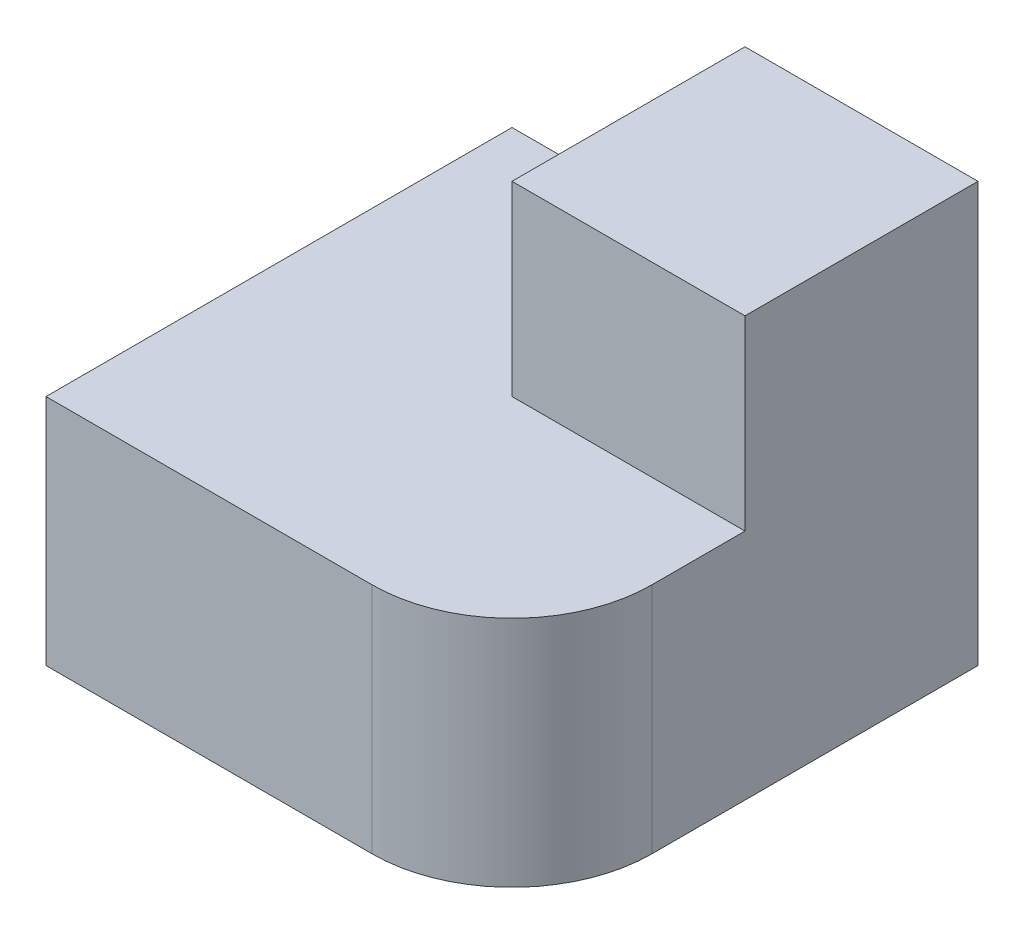
ISO-10303-21;
HEADER;
FILE_DESCRIPTION(('STEP AP214'),'2;1');
FILE_NAME('part.step','',(''),(''),'','','');
FILE_SCHEMA(('AUTOMOTIVE_DESIGN { 1 0 10303 214 1 1 1 1 }'));
ENDSEC;
DATA;
#1=APPLICATION_CONTEXT('core data for automotive mechanical design processes');
#2=APPLICATION_PROTOCOL_DEFINITION('international standard','automotive_design',2000,#1);
#3=PRODUCT_CONTEXT('',#1,'mechanical');
#4=PRODUCT('Part','Part','',(#3));
#5=PRODUCT_RELATED_PRODUCT_CATEGORY('part','',(#4));
#6=PRODUCT_DEFINITION_FORMATION('','',#4);
#7=PRODUCT_DEFINITION_CONTEXT('part definition',#1,'design');
#8=PRODUCT_DEFINITION('design','',#6,#7);
#9=PRODUCT_DEFINITION_SHAPE('','',#8);
#10=(LENGTH_UNIT() NAMED_UNIT(*) SI_UNIT(.MILLI.,.METRE.));
#11=(NAMED_UNIT(*) PLANE_ANGLE_UNIT() SI_UNIT($,.RADIAN.));
#12=(NAMED_UNIT(*) SI_UNIT($,.STERADIAN.) SOLID_ANGLE_UNIT());
#13=UNCERTAINTY_MEASURE_WITH_UNIT(LENGTH_MEASURE(1.E-05),#10,'distance_accuracy_value','');
#14=(GEOMETRIC_REPRESENTATION_CONTEXT(3) GLOBAL_UNCERTAINTY_ASSIGNED_CONTEXT((#13)) GLOBAL_UNIT_ASSIGNED_CONTEXT((#10,
#11,#12)) REPRESENTATION_CONTEXT('',''));
#15=CARTESIAN_POINT('',(0.,0.,0.));
#16=DIRECTION('',(0.,0.,1.));
#17=DIRECTION('',(1.,0.,0.));
#18=AXIS2_PLACEMENT_3D('',#15,#16,#17);
#19=CARTESIAN_POINT('',(-5.,5.,5.));
#20=DIRECTION('',(1.,0.,0.));
#21=DIRECTION('',(0.,0.,-1.));
#22=AXIS2_PLACEMENT_3D('',#19,#20,#21);
#23=PLANE('',#22);
#24=DIRECTION('',(0.,0.,1.));
#25=VECTOR('',#24,1.);
#26=CARTESIAN_POINT('',(-5.,0.,5.));
#27=LINE('',#26,#25);
#28=CARTESIAN_POINT('',(-5.,0.,-5.));
#29=VERTEX_POINT('',#28);
#30=CARTESIAN_POINT('',(-5.,0.,5.));
#31=VERTEX_POINT('',#30);
#32=EDGE_CURVE('E140',#29,#31,#27,.T.);
#33=ORIENTED_EDGE('',*,*,#32,.T.);
#34=DIRECTION('',(0.,-1.,0.));
#35=VECTOR('',#34,1.);
#36=CARTESIAN_POINT('',(-5.,5.,5.));
#37=LINE('',#36,#35);
#38=CARTESIAN_POINT('',(-5.,5.,5.));
#39=VERTEX_POINT('',#38);
#40=EDGE_CURVE('E107',#39,#31,#37,.T.);
#41=ORIENTED_EDGE('',*,*,#40,.F.);
#42=DIRECTION('',(0.,0.,1.));
#43=VECTOR('',#42,1.);
#44=CARTESIAN_POINT('',(-5.,5.,5.));
#45=LINE('',#44,#43);
#46=CARTESIAN_POINT('',(-5.,5.,-5.));
#47=VERTEX_POINT('',#46);
#48=EDGE_CURVE('E141',#47,#39,#45,.T.);
#49=ORIENTED_EDGE('',*,*,#48,.F.);
#50=DIRECTION('',(0.,-1.,0.));
#51=VECTOR('',#50,1.);
#52=CARTESIAN_POINT('',(-5.,5.,-5.));
#53=LINE('',#52,#51);
#54=EDGE_CURVE('E108',#47,#29,#53,.T.);
#55=ORIENTED_EDGE('',*,*,#54,.T.);
#56=EDGE_LOOP('',(#33,#41,#49,#55));
#57=FACE_BOUND('',#56,.T.);
#58=ADVANCED_FACE('F33',(#57),#23,.F.);
#59=CARTESIAN_POINT('',(5.,5.,5.));
#60=DIRECTION('',(0.,0.,-1.));
#61=DIRECTION('',(-1.,0.,0.));
#62=AXIS2_PLACEMENT_3D('',#59,#60,#61);
#63=PLANE('',#62);
#64=DIRECTION('',(1.,0.,0.));
#65=VECTOR('',#64,1.);
#66=CARTESIAN_POINT('',(5.,0.,5.));
#67=LINE('',#66,#65);
#68=CARTESIAN_POINT('',(2.,0.,5.));
#69=VERTEX_POINT('',#68);
#70=EDGE_CURVE('E153',#31,#69,#67,.T.);
#71=ORIENTED_EDGE('',*,*,#70,.T.);
#72=DIRECTION('',(0.,-1.,0.));
#73=VECTOR('',#72,1.);
#74=CARTESIAN_POINT('',(2.,5.,5.));
#75=LINE('',#74,#73);
#76=CARTESIAN_POINT('',(2.,5.,5.));
#77=VERTEX_POINT('',#76);
#78=EDGE_CURVE('E41',#69,#77,#75,.F.);
#79=ORIENTED_EDGE('',*,*,#78,.T.);
#80=DIRECTION('',(1.,0.,0.));
#81=VECTOR('',#80,1.);
#82=CARTESIAN_POINT('',(5.,5.,5.));
#83=LINE('',#82,#81);
#84=EDGE_CURVE('E144',#39,#77,#83,.T.);
#85=ORIENTED_EDGE('',*,*,#84,.F.);
#86=ORIENTED_EDGE('',*,*,#40,.T.);
#87=EDGE_LOOP('',(#71,#79,#85,#86));
#88=FACE_BOUND('',#87,.T.);
#89=ADVANCED_FACE('F185',(#88),#63,.F.);
#90=CARTESIAN_POINT('',(5.,5.,5.));
#91=DIRECTION('',(-1.,0.,0.));
#92=DIRECTION('',(0.,0.,1.));
#93=AXIS2_PLACEMENT_3D('',#90,#91,#92);
#94=PLANE('',#93);
#95=DIRECTION('',(0.,0.,-1.));
#96=VECTOR('',#95,1.);
#97=CARTESIAN_POINT('',(5.,5.,5.));
#98=LINE('',#97,#96);
#99=CARTESIAN_POINT('',(5.,5.,2.));
#100=VERTEX_POINT('',#99);
#101=CARTESIAN_POINT('',(5.,5.,0.));
#102=VERTEX_POINT('',#101);
#103=EDGE_CURVE('E147',#100,#102,#98,.T.);
#104=ORIENTED_EDGE('',*,*,#103,.F.);
#105=DIRECTION('',(0.,-1.,0.));
#106=VECTOR('',#105,1.);
#107=CARTESIAN_POINT('',(5.,5.,2.));
#108=LINE('',#107,#106);
#109=CARTESIAN_POINT('',(5.,0.,2.));
#110=VERTEX_POINT('',#109);
#111=EDGE_CURVE('E161',#100,#110,#108,.T.);
#112=ORIENTED_EDGE('',*,*,#111,.T.);
#113=DIRECTION('',(0.,0.,-1.));
#114=VECTOR('',#113,1.);
#115=CARTESIAN_POINT('',(5.,0.,5.));
#116=LINE('',#115,#114);
#117=CARTESIAN_POINT('',(5.,0.,-5.));
#118=VERTEX_POINT('',#117);
#119=EDGE_CURVE('E104',#110,#118,#116,.T.);
#120=ORIENTED_EDGE('',*,*,#119,.T.);
#121=DIRECTION('',(0.,-1.,0.));
#122=VECTOR('',#121,1.);
#123=CARTESIAN_POINT('',(5.,5.,-5.));
#124=LINE('',#123,#122);
#125=CARTESIAN_POINT('',(5.,9.,-5.));
#126=VERTEX_POINT('',#125);
#127=EDGE_CURVE('E96',#126,#118,#124,.T.);
#128=ORIENTED_EDGE('',*,*,#127,.F.);
#129=DIRECTION('',(0.,0.,-1.));
#130=VECTOR('',#129,1.);
#131=CARTESIAN_POINT('',(5.,9.,-5.));
#132=LINE('',#131,#130);
#133=CARTESIAN_POINT('',(5.,9.,0.));
#134=VERTEX_POINT('',#133);
#135=EDGE_CURVE('E102',#134,#126,#132,.T.);
#136=ORIENTED_EDGE('',*,*,#135,.F.);
#137=DIRECTION('',(0.,-1.,0.));
#138=VECTOR('',#137,1.);
#139=CARTESIAN_POINT('',(5.,9.,0.));
#140=LINE('',#139,#138);
#141=EDGE_CURVE('E132',#134,#102,#140,.T.);
#142=ORIENTED_EDGE('',*,*,#141,.T.);
#143=EDGE_LOOP('',(#104,#112,#120,#128,#136,#142));
#144=FACE_BOUND('',#143,.T.);
#145=ADVANCED_FACE('F99',(#144),#94,.F.);
#146=CARTESIAN_POINT('',(5.,5.,-5.));
#147=DIRECTION('',(0.,0.,1.));
#148=DIRECTION('',(1.,0.,0.));
#149=AXIS2_PLACEMENT_3D('',#146,#147,#148);
#150=PLANE('',#149);
#151=DIRECTION('',(-1.,0.,0.));
#152=VECTOR('',#151,1.);
#153=CARTESIAN_POINT('',(5.,0.,-5.));
#154=LINE('',#153,#152);
#155=EDGE_CURVE('E145',#118,#29,#154,.T.);
#156=ORIENTED_EDGE('',*,*,#155,.T.);
#157=ORIENTED_EDGE('',*,*,#54,.F.);
#158=DIRECTION('',(-1.,0.,0.));
#159=VECTOR('',#158,1.);
#160=CARTESIAN_POINT('',(5.,5.,-5.));
#161=LINE('',#160,#159);
#162=CARTESIAN_POINT('',(0.,5.,-5.));
#163=VERTEX_POINT('',#162);
#164=EDGE_CURVE('E149',#163,#47,#161,.T.);
#165=ORIENTED_EDGE('',*,*,#164,.F.);
#166=DIRECTION('',(0.,-1.,0.));
#167=VECTOR('',#166,1.);
#168=CARTESIAN_POINT('',(0.,9.,-5.));
#169=LINE('',#168,#167);
#170=CARTESIAN_POINT('',(0.,9.,-5.));
#171=VERTEX_POINT('',#170);
#172=EDGE_CURVE('E115',#171,#163,#169,.T.);
#173=ORIENTED_EDGE('',*,*,#172,.F.);
#174=DIRECTION('',(-1.,0.,0.));
#175=VECTOR('',#174,1.);
#176=CARTESIAN_POINT('',(5.,9.,-5.));
#177=LINE('',#176,#175);
#178=EDGE_CURVE('E111',#126,#171,#177,.T.);
#179=ORIENTED_EDGE('',*,*,#178,.F.);
#180=ORIENTED_EDGE('',*,*,#127,.T.);
#181=EDGE_LOOP('',(#156,#157,#165,#173,#179,#180));
#182=FACE_BOUND('',#181,.T.);
#183=ADVANCED_FACE('F112',(#182),#150,.F.);
#184=CARTESIAN_POINT('',(0.,5.,0.));
#185=DIRECTION('',(0.,1.,0.));
#186=DIRECTION('',(0.,0.,1.));
#187=AXIS2_PLACEMENT_3D('',#184,#185,#186);
#188=PLANE('',#187);
#189=ORIENTED_EDGE('',*,*,#84,.T.);
#190=CARTESIAN_POINT('',(2.,5.,2.));
#191=DIRECTION('',(0.,1.,0.));
#192=DIRECTION('',(0.,0.,1.));
#193=AXIS2_PLACEMENT_3D('',#190,#191,#192);
#194=CIRCLE('',#193,3.);
#195=EDGE_CURVE('E11',#77,#100,#194,.T.);
#196=ORIENTED_EDGE('',*,*,#195,.T.);
#197=ORIENTED_EDGE('',*,*,#103,.T.);
#198=DIRECTION('',(1.,0.,0.));
#199=VECTOR('',#198,1.);
#200=CARTESIAN_POINT('',(5.,5.,0.));
#201=LINE('',#200,#199);
#202=CARTESIAN_POINT('',(0.,5.,0.));
#203=VERTEX_POINT('',#202);
#204=EDGE_CURVE('E124',#203,#102,#201,.T.);
#205=ORIENTED_EDGE('',*,*,#204,.F.);
#206=DIRECTION('',(0.,0.,1.));
#207=VECTOR('',#206,1.);
#208=CARTESIAN_POINT('',(0.,5.,-5.));
#209=LINE('',#208,#207);
#210=EDGE_CURVE('E127',#163,#203,#209,.T.);
#211=ORIENTED_EDGE('',*,*,#210,.F.);
#212=ORIENTED_EDGE('',*,*,#164,.T.);
#213=ORIENTED_EDGE('',*,*,#48,.T.);
#214=EDGE_LOOP('',(#189,#196,#197,#205,#211,#212,#213));
#215=FACE_BOUND('',#214,.T.);
#216=ADVANCED_FACE('F173',(#215),#188,.T.);
#217=CARTESIAN_POINT('',(0.,0.,0.));
#218=DIRECTION('',(0.,1.,0.));
#219=DIRECTION('',(0.,0.,1.));
#220=AXIS2_PLACEMENT_3D('',#217,#218,#219);
#221=PLANE('',#220);
#222=ORIENTED_EDGE('',*,*,#119,.F.);
#223=CARTESIAN_POINT('',(2.,0.,2.));
#224=DIRECTION('',(0.,1.,0.));
#225=DIRECTION('',(0.,0.,1.));
#226=AXIS2_PLACEMENT_3D('',#223,#224,#225);
#227=CIRCLE('',#226,3.);
#228=EDGE_CURVE('E55',#110,#69,#227,.F.);
#229=ORIENTED_EDGE('',*,*,#228,.T.);
#230=ORIENTED_EDGE('',*,*,#70,.F.);
#231=ORIENTED_EDGE('',*,*,#32,.F.);
#232=ORIENTED_EDGE('',*,*,#155,.F.);
#233=EDGE_LOOP('',(#222,#229,#230,#231,#232));
#234=FACE_BOUND('',#233,.T.);
#235=ADVANCED_FACE('F166',(#234),#221,.F.);
#236=CARTESIAN_POINT('',(0.,9.,-5.));
#237=DIRECTION('',(1.,0.,0.));
#238=DIRECTION('',(0.,0.,-1.));
#239=AXIS2_PLACEMENT_3D('',#236,#237,#238);
#240=PLANE('',#239);
#241=ORIENTED_EDGE('',*,*,#210,.T.);
#242=DIRECTION('',(0.,-1.,0.));
#243=VECTOR('',#242,1.);
#244=CARTESIAN_POINT('',(0.,9.,0.));
#245=LINE('',#244,#243);
#246=CARTESIAN_POINT('',(0.,9.,0.));
#247=VERTEX_POINT('',#246);
#248=EDGE_CURVE('E136',#247,#203,#245,.T.);
#249=ORIENTED_EDGE('',*,*,#248,.F.);
#250=DIRECTION('',(0.,0.,1.));
#251=VECTOR('',#250,1.);
#252=CARTESIAN_POINT('',(0.,9.,-5.));
#253=LINE('',#252,#251);
#254=EDGE_CURVE('E118',#171,#247,#253,.T.);
#255=ORIENTED_EDGE('',*,*,#254,.F.);
#256=ORIENTED_EDGE('',*,*,#172,.T.);
#257=EDGE_LOOP('',(#241,#249,#255,#256));
#258=FACE_BOUND('',#257,.T.);
#259=ADVANCED_FACE('F175',(#258),#240,.F.);
#260=CARTESIAN_POINT('',(5.,9.,0.));
#261=DIRECTION('',(0.,0.,-1.));
#262=DIRECTION('',(-1.,0.,0.));
#263=AXIS2_PLACEMENT_3D('',#260,#261,#262);
#264=PLANE('',#263);
#265=ORIENTED_EDGE('',*,*,#204,.T.);
#266=ORIENTED_EDGE('',*,*,#141,.F.);
#267=DIRECTION('',(1.,0.,0.));
#268=VECTOR('',#267,1.);
#269=CARTESIAN_POINT('',(5.,9.,0.));
#270=LINE('',#269,#268);
#271=EDGE_CURVE('E122',#247,#134,#270,.T.);
#272=ORIENTED_EDGE('',*,*,#271,.F.);
#273=ORIENTED_EDGE('',*,*,#248,.T.);
#274=EDGE_LOOP('',(#265,#266,#272,#273));
#275=FACE_BOUND('',#274,.T.);
#276=ADVANCED_FACE('F178',(#275),#264,.F.);
#277=CARTESIAN_POINT('',(0.,9.,0.));
#278=DIRECTION('',(0.,-1.,0.));
#279=DIRECTION('',(0.,0.,-1.));
#280=AXIS2_PLACEMENT_3D('',#277,#278,#279);
#281=PLANE('',#280);
#282=ORIENTED_EDGE('',*,*,#135,.T.);
#283=ORIENTED_EDGE('',*,*,#178,.T.);
#284=ORIENTED_EDGE('',*,*,#254,.T.);
#285=ORIENTED_EDGE('',*,*,#271,.T.);
#286=EDGE_LOOP('',(#282,#283,#284,#285));
#287=FACE_BOUND('',#286,.T.);
#288=ADVANCED_FACE('F120',(#287),#281,.F.);
#289=CARTESIAN_POINT('',(2.,5.,2.));
#290=DIRECTION('',(0.,-1.,0.));
#291=DIRECTION('',(0.,0.,-1.));
#292=AXIS2_PLACEMENT_3D('',#289,#290,#291);
#293=CYLINDRICAL_SURFACE('',#292,3.);
#294=ORIENTED_EDGE('',*,*,#195,.F.);
#295=ORIENTED_EDGE('',*,*,#78,.F.);
#296=ORIENTED_EDGE('',*,*,#228,.F.);
#297=ORIENTED_EDGE('',*,*,#111,.F.);
#298=EDGE_LOOP('',(#294,#295,#296,#297));
#299=FACE_BOUND('',#298,.T.);
#300=ADVANCED_FACE('F35',(#299),#293,.T.);
#301=CLOSED_SHELL('',(#58,#89,#145,#183,#216,#235,#259,#276,#288,#300));
#302=MANIFOLD_SOLID_BREP('B2',#301);
#303=ADVANCED_BREP_SHAPE_REPRESENTATION('',(#18,#302),#14);
#304=SHAPE_DEFINITION_REPRESENTATION(#9,#303);
ENDSEC;
END-ISO-10303-21;
